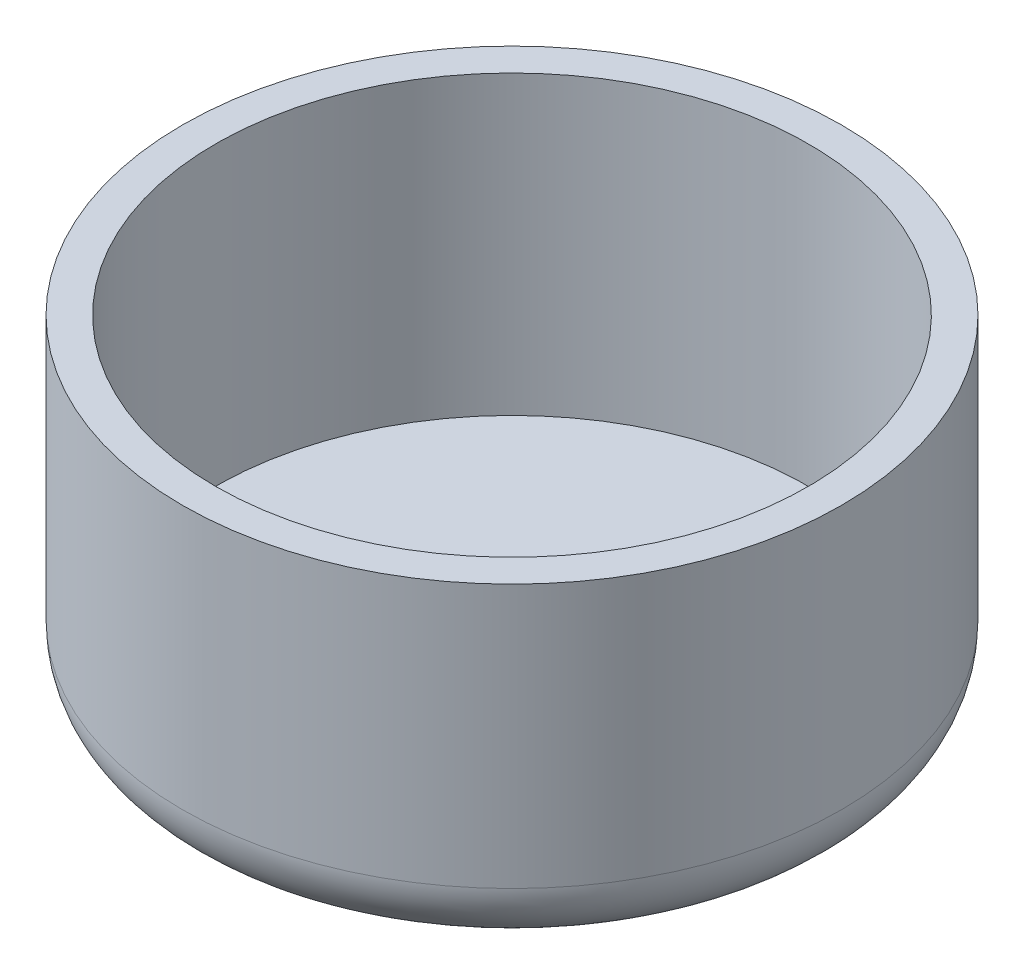
ISO-10303-21;
HEADER;
FILE_DESCRIPTION(('STEP AP214'),'2;1');
FILE_NAME('part.step','',(''),(''),'','','');
FILE_SCHEMA(('AUTOMOTIVE_DESIGN { 1 0 10303 214 1 1 1 1 }'));
ENDSEC;
DATA;
#1=APPLICATION_CONTEXT('core data for automotive mechanical design processes');
#2=APPLICATION_PROTOCOL_DEFINITION('international standard','automotive_design',2000,#1);
#3=PRODUCT_CONTEXT('',#1,'mechanical');
#4=PRODUCT('Part','Part','',(#3));
#5=PRODUCT_RELATED_PRODUCT_CATEGORY('part','',(#4));
#6=PRODUCT_DEFINITION_FORMATION('','',#4);
#7=PRODUCT_DEFINITION_CONTEXT('part definition',#1,'design');
#8=PRODUCT_DEFINITION('design','',#6,#7);
#9=PRODUCT_DEFINITION_SHAPE('','',#8);
#10=(LENGTH_UNIT() NAMED_UNIT(*) SI_UNIT(.MILLI.,.METRE.));
#11=(NAMED_UNIT(*) PLANE_ANGLE_UNIT() SI_UNIT($,.RADIAN.));
#12=(NAMED_UNIT(*) SI_UNIT($,.STERADIAN.) SOLID_ANGLE_UNIT());
#13=UNCERTAINTY_MEASURE_WITH_UNIT(LENGTH_MEASURE(1.E-05),#10,'distance_accuracy_value','');
#14=(GEOMETRIC_REPRESENTATION_CONTEXT(3) GLOBAL_UNCERTAINTY_ASSIGNED_CONTEXT((#13)) GLOBAL_UNIT_ASSIGNED_CONTEXT((#10,
#11,#12)) REPRESENTATION_CONTEXT('',''));
#15=CARTESIAN_POINT('',(0.,0.,0.));
#16=DIRECTION('',(0.,0.,1.));
#17=DIRECTION('',(1.,0.,0.));
#18=AXIS2_PLACEMENT_3D('',#15,#16,#17);
#19=CARTESIAN_POINT('',(0.,100.,0.));
#20=DIRECTION('',(0.,-1.,0.));
#21=DIRECTION('',(0.,0.,-1.));
#22=AXIS2_PLACEMENT_3D('',#19,#20,#21);
#23=CYLINDRICAL_SURFACE('',#22,100.);
#24=CARTESIAN_POINT('',(0.,20.,0.));
#25=DIRECTION('',(0.,1.,0.));
#26=DIRECTION('',(0.,0.,1.));
#27=AXIS2_PLACEMENT_3D('',#24,#25,#26);
#28=CIRCLE('',#27,100.);
#29=CARTESIAN_POINT('',(0.,20.,100.));
#30=VERTEX_POINT('',#29);
#31=EDGE_CURVE('E48',#30,#30,#28,.T.);
#32=ORIENTED_EDGE('',*,*,#31,.T.);
#33=EDGE_LOOP('',(#32));
#34=FACE_BOUND('',#33,.T.);
#35=CARTESIAN_POINT('',(0.,100.,0.));
#36=DIRECTION('',(0.,1.,0.));
#37=DIRECTION('',(0.,0.,1.));
#38=AXIS2_PLACEMENT_3D('',#35,#36,#37);
#39=CIRCLE('',#38,100.);
#40=CARTESIAN_POINT('',(0.,100.,100.));
#41=VERTEX_POINT('',#40);
#42=EDGE_CURVE('E52',#41,#41,#39,.T.);
#43=ORIENTED_EDGE('',*,*,#42,.F.);
#44=EDGE_LOOP('',(#43));
#45=FACE_BOUND('',#44,.T.);
#46=ADVANCED_FACE('F37',(#34,#45),#23,.T.);
#47=CARTESIAN_POINT('',(0.,100.,0.));
#48=DIRECTION('',(0.,1.,0.));
#49=DIRECTION('',(0.,0.,1.));
#50=AXIS2_PLACEMENT_3D('',#47,#48,#49);
#51=PLANE('',#50);
#52=CARTESIAN_POINT('',(0.,100.,0.));
#53=DIRECTION('',(0.,1.,0.));
#54=DIRECTION('',(0.,0.,1.));
#55=AXIS2_PLACEMENT_3D('',#52,#53,#54);
#56=CIRCLE('',#55,90.);
#57=CARTESIAN_POINT('',(0.,100.,90.));
#58=VERTEX_POINT('',#57);
#59=EDGE_CURVE('E58',#58,#58,#56,.T.);
#60=ORIENTED_EDGE('',*,*,#59,.F.);
#61=EDGE_LOOP('',(#60));
#62=FACE_BOUND('',#61,.T.);
#63=ORIENTED_EDGE('',*,*,#42,.T.);
#64=EDGE_LOOP('',(#63));
#65=FACE_BOUND('',#64,.T.);
#66=ADVANCED_FACE('F82',(#62,#65),#51,.T.);
#67=CARTESIAN_POINT('',(0.,0.,0.));
#68=DIRECTION('',(0.,1.,0.));
#69=DIRECTION('',(0.,0.,1.));
#70=AXIS2_PLACEMENT_3D('',#67,#68,#69);
#71=PLANE('',#70);
#72=CARTESIAN_POINT('',(0.,0.,0.));
#73=DIRECTION('',(0.,1.,0.));
#74=DIRECTION('',(0.,0.,1.));
#75=AXIS2_PLACEMENT_3D('',#72,#73,#74);
#76=CIRCLE('',#75,4.);
#77=CARTESIAN_POINT('',(0.,0.,4.));
#78=VERTEX_POINT('',#77);
#79=EDGE_CURVE('E10',#78,#78,#76,.F.);
#80=ORIENTED_EDGE('',*,*,#79,.F.);
#81=EDGE_LOOP('',(#80));
#82=FACE_BOUND('',#81,.T.);
#83=CARTESIAN_POINT('',(0.,0.,0.));
#84=DIRECTION('',(0.,1.,0.));
#85=DIRECTION('',(0.,0.,1.));
#86=AXIS2_PLACEMENT_3D('',#83,#84,#85);
#87=CIRCLE('',#86,80.);
#88=CARTESIAN_POINT('',(0.,0.,80.));
#89=VERTEX_POINT('',#88);
#90=EDGE_CURVE('E44',#89,#89,#87,.F.);
#91=ORIENTED_EDGE('',*,*,#90,.T.);
#92=EDGE_LOOP('',(#91));
#93=FACE_BOUND('',#92,.T.);
#94=ADVANCED_FACE('F88',(#82,#93),#71,.F.);
#95=CARTESIAN_POINT('',(0.,10.,0.));
#96=DIRECTION('',(0.,1.,0.));
#97=DIRECTION('',(0.,0.,1.));
#98=AXIS2_PLACEMENT_3D('',#95,#96,#97);
#99=CYLINDRICAL_SURFACE('',#98,90.);
#100=CARTESIAN_POINT('',(0.,10.,0.));
#101=DIRECTION('',(0.,1.,0.));
#102=DIRECTION('',(0.,0.,1.));
#103=AXIS2_PLACEMENT_3D('',#100,#101,#102);
#104=CIRCLE('',#103,90.);
#105=CARTESIAN_POINT('',(0.,10.,90.));
#106=VERTEX_POINT('',#105);
#107=EDGE_CURVE('E57',#106,#106,#104,.T.);
#108=CARTESIAN_POINT('',(0.,10.,90.));
#109=CARTESIAN_POINT('',(0.,10.9375,90.));
#110=CARTESIAN_POINT('',(0.,11.875,90.));
#111=CARTESIAN_POINT('',(0.,13.75,90.));
#112=CARTESIAN_POINT('',(0.,14.6875,90.));
#113=CARTESIAN_POINT('',(0.,16.5625,90.));
#114=CARTESIAN_POINT('',(0.,17.5,90.));
#115=CARTESIAN_POINT('',(0.,19.375,90.));
#116=CARTESIAN_POINT('',(0.,20.3125,90.));
#117=CARTESIAN_POINT('',(0.,22.1875,90.));
#118=CARTESIAN_POINT('',(0.,23.125,90.));
#119=CARTESIAN_POINT('',(0.,25.,90.));
#120=CARTESIAN_POINT('',(0.,25.9375,90.));
#121=CARTESIAN_POINT('',(0.,27.8125,90.));
#122=CARTESIAN_POINT('',(0.,28.75,90.));
#123=CARTESIAN_POINT('',(0.,30.625,90.));
#124=CARTESIAN_POINT('',(0.,31.5625,90.));
#125=CARTESIAN_POINT('',(0.,33.4375,90.));
#126=CARTESIAN_POINT('',(0.,34.375,90.));
#127=CARTESIAN_POINT('',(0.,36.25,90.));
#128=CARTESIAN_POINT('',(0.,37.1875,90.));
#129=CARTESIAN_POINT('',(0.,39.0625,90.));
#130=CARTESIAN_POINT('',(0.,40.,90.));
#131=CARTESIAN_POINT('',(0.,41.875,90.));
#132=CARTESIAN_POINT('',(0.,42.8125,90.));
#133=CARTESIAN_POINT('',(0.,44.6875,90.));
#134=CARTESIAN_POINT('',(0.,45.625,90.));
#135=CARTESIAN_POINT('',(0.,47.5,90.));
#136=CARTESIAN_POINT('',(0.,48.4375,90.));
#137=CARTESIAN_POINT('',(0.,50.3125,90.));
#138=CARTESIAN_POINT('',(0.,51.25,90.));
#139=CARTESIAN_POINT('',(0.,53.125,90.));
#140=CARTESIAN_POINT('',(0.,54.0625,90.));
#141=CARTESIAN_POINT('',(0.,55.9375,90.));
#142=CARTESIAN_POINT('',(0.,56.875,90.));
#143=CARTESIAN_POINT('',(0.,58.75,90.));
#144=CARTESIAN_POINT('',(0.,59.6875,90.));
#145=CARTESIAN_POINT('',(0.,61.5625,90.));
#146=CARTESIAN_POINT('',(0.,62.5,90.));
#147=CARTESIAN_POINT('',(0.,64.375,90.));
#148=CARTESIAN_POINT('',(0.,65.3125,90.));
#149=CARTESIAN_POINT('',(0.,67.1875,90.));
#150=CARTESIAN_POINT('',(0.,68.125,90.));
#151=CARTESIAN_POINT('',(0.,70.,90.));
#152=CARTESIAN_POINT('',(0.,70.9375,90.));
#153=CARTESIAN_POINT('',(0.,72.8125,90.));
#154=CARTESIAN_POINT('',(0.,73.75,90.));
#155=CARTESIAN_POINT('',(0.,75.625,90.));
#156=CARTESIAN_POINT('',(0.,76.5625,90.));
#157=CARTESIAN_POINT('',(0.,78.4375,90.));
#158=CARTESIAN_POINT('',(0.,79.375,90.));
#159=CARTESIAN_POINT('',(0.,81.25,90.));
#160=CARTESIAN_POINT('',(0.,82.1875,90.));
#161=CARTESIAN_POINT('',(0.,84.0625,90.));
#162=CARTESIAN_POINT('',(0.,85.,90.));
#163=CARTESIAN_POINT('',(0.,86.875,90.));
#164=CARTESIAN_POINT('',(0.,87.8125,90.));
#165=CARTESIAN_POINT('',(0.,89.6875,90.));
#166=CARTESIAN_POINT('',(0.,90.625,90.));
#167=CARTESIAN_POINT('',(0.,92.5,90.));
#168=CARTESIAN_POINT('',(0.,93.4375,90.));
#169=CARTESIAN_POINT('',(0.,95.3125,90.));
#170=CARTESIAN_POINT('',(0.,96.25,90.));
#171=CARTESIAN_POINT('',(0.,98.125,90.));
#172=CARTESIAN_POINT('',(0.,99.0625,90.));
#173=CARTESIAN_POINT('',(0.,100.,90.));
#174=B_SPLINE_CURVE_WITH_KNOTS('',3,(#108,#109,#110,#111,#112,#113,#114,#115,#116,#117,#118,
#119,#120,#121,#122,#123,#124,#125,#126,#127,#128,#129,#130,#131,#132,#133,#134,#135,#136,#137,
#138,#139,#140,#141,#142,#143,#144,#145,#146,#147,#148,#149,#150,#151,#152,#153,#154,#155,#156,
#157,#158,#159,#160,#161,#162,#163,#164,#165,#166,#167,#168,#169,#170,#171,#172,#173),
.UNSPECIFIED.,.F.,.F.,(4,2,2,2,2,2,2,2,2,2,2,2,2,2,2,2,2,2,2,2,2,2,2,2,2,2,2,2,2,2,2,2,4),(0.,
2.8125,5.625,8.4375,11.25,14.0625,16.875,19.6875,22.5,25.3125,28.125,30.9375,33.75,36.5625,
39.375,42.1875,45.,47.8125,50.625,53.4375,56.25,59.0625,61.875,64.6875,67.5,70.3125,73.125,
75.9375,78.75,81.5625,84.375,87.1875,90.),.UNSPECIFIED.);
#175=EDGE_CURVE('BSEAM93',#106,#58,#174,.T.);
#176=ORIENTED_EDGE('',*,*,#107,.F.);
#177=ORIENTED_EDGE('',*,*,#59,.T.);
#178=ORIENTED_EDGE('',*,*,#175,.T.);
#179=ORIENTED_EDGE('',*,*,#175,.F.);
#180=EDGE_LOOP('',(#176,#178,#177,#179));
#181=FACE_BOUND('',#180,.T.);
#182=ADVANCED_FACE('F93',(#181),#99,.F.);
#183=CARTESIAN_POINT('',(0.,10.,0.));
#184=DIRECTION('',(0.,1.,0.));
#185=DIRECTION('',(0.,0.,1.));
#186=AXIS2_PLACEMENT_3D('',#183,#184,#185);
#187=PLANE('',#186);
#188=ORIENTED_EDGE('',*,*,#107,.T.);
#189=EDGE_LOOP('',(#188));
#190=FACE_BOUND('',#189,.T.);
#191=ADVANCED_FACE('F78',(#190),#187,.T.);
#192=CARTESIAN_POINT('',(0.,20.,0.));
#193=DIRECTION('',(0.,1.,0.));
#194=DIRECTION('',(0.,0.,1.));
#195=AXIS2_PLACEMENT_3D('',#192,#193,#194);
#196=TOROIDAL_SURFACE('',#195,80.,20.);
#197=ORIENTED_EDGE('',*,*,#90,.F.);
#198=EDGE_LOOP('',(#197));
#199=FACE_BOUND('',#198,.T.);
#200=ORIENTED_EDGE('',*,*,#31,.F.);
#201=EDGE_LOOP('',(#200));
#202=FACE_BOUND('',#201,.T.);
#203=ADVANCED_FACE('F39',(#199,#202),#196,.T.);
#204=CARTESIAN_POINT('',(0.,-3.,0.));
#205=DIRECTION('',(0.,1.,0.));
#206=DIRECTION('',(0.,0.,1.));
#207=AXIS2_PLACEMENT_3D('',#204,#205,#206);
#208=CYLINDRICAL_SURFACE('',#207,4.);
#209=CARTESIAN_POINT('',(0.,-3.,0.));
#210=DIRECTION('',(0.,-1.,0.));
#211=DIRECTION('',(0.,0.,-1.));
#212=AXIS2_PLACEMENT_3D('',#209,#210,#211);
#213=CIRCLE('',#212,4.);
#214=CARTESIAN_POINT('',(0.,-3.,-4.));
#215=VERTEX_POINT('',#214);
#216=EDGE_CURVE('E61',#215,#215,#213,.T.);
#217=ORIENTED_EDGE('',*,*,#216,.F.);
#218=EDGE_LOOP('',(#217));
#219=FACE_BOUND('',#218,.T.);
#220=ORIENTED_EDGE('',*,*,#79,.T.);
#221=EDGE_LOOP('',(#220));
#222=FACE_BOUND('',#221,.T.);
#223=ADVANCED_FACE('F69',(#219,#222),#208,.T.);
#224=CARTESIAN_POINT('',(0.,-3.,0.));
#225=DIRECTION('',(0.,-1.,0.));
#226=DIRECTION('',(0.,0.,-1.));
#227=AXIS2_PLACEMENT_3D('',#224,#225,#226);
#228=PLANE('',#227);
#229=ORIENTED_EDGE('',*,*,#216,.T.);
#230=EDGE_LOOP('',(#229));
#231=FACE_BOUND('',#230,.T.);
#232=ADVANCED_FACE('F67',(#231),#228,.T.);
#233=CLOSED_SHELL('',(#46,#66,#94,#182,#191,#203,#223,#232));
#234=MANIFOLD_SOLID_BREP('B2',#233);
#235=ADVANCED_BREP_SHAPE_REPRESENTATION('',(#18,#234),#14);
#236=SHAPE_DEFINITION_REPRESENTATION(#9,#235);
ENDSEC;
END-ISO-10303-21;
